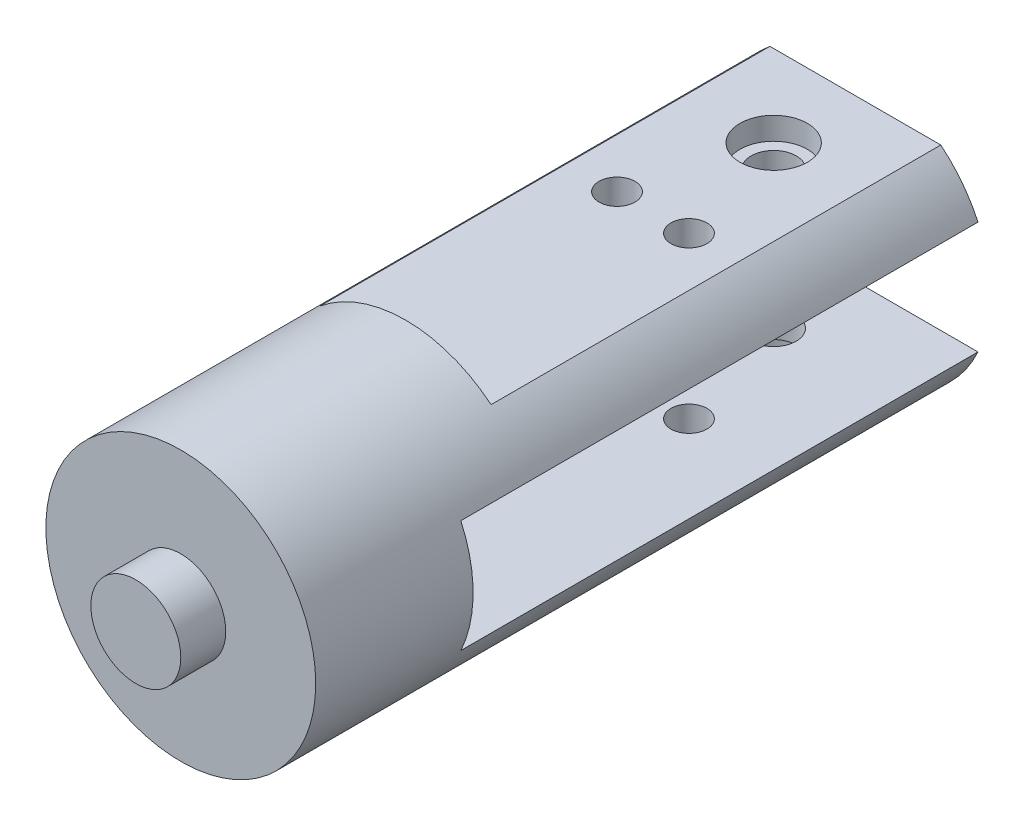
ISO-10303-21;
HEADER;
FILE_DESCRIPTION(('STEP AP214'),'2;1');
FILE_NAME('part.step','',(''),(''),'','','');
FILE_SCHEMA(('AUTOMOTIVE_DESIGN { 1 0 10303 214 1 1 1 1 }'));
ENDSEC;
DATA;
#1=APPLICATION_CONTEXT('core data for automotive mechanical design processes');
#2=APPLICATION_PROTOCOL_DEFINITION('international standard','automotive_design',2000,#1);
#3=PRODUCT_CONTEXT('',#1,'mechanical');
#4=PRODUCT('Part','Part','',(#3));
#5=PRODUCT_RELATED_PRODUCT_CATEGORY('part','',(#4));
#6=PRODUCT_DEFINITION_FORMATION('','',#4);
#7=PRODUCT_DEFINITION_CONTEXT('part definition',#1,'design');
#8=PRODUCT_DEFINITION('design','',#6,#7);
#9=PRODUCT_DEFINITION_SHAPE('','',#8);
#10=(LENGTH_UNIT() NAMED_UNIT(*) SI_UNIT(.MILLI.,.METRE.));
#11=(NAMED_UNIT(*) PLANE_ANGLE_UNIT() SI_UNIT($,.RADIAN.));
#12=(NAMED_UNIT(*) SI_UNIT($,.STERADIAN.) SOLID_ANGLE_UNIT());
#13=UNCERTAINTY_MEASURE_WITH_UNIT(LENGTH_MEASURE(1.E-05),#10,'distance_accuracy_value','');
#14=(GEOMETRIC_REPRESENTATION_CONTEXT(3) GLOBAL_UNCERTAINTY_ASSIGNED_CONTEXT((#13)) GLOBAL_UNIT_ASSIGNED_CONTEXT((#10,
#11,#12)) REPRESENTATION_CONTEXT('',''));
#15=CARTESIAN_POINT('',(0.,0.,0.));
#16=DIRECTION('',(0.,0.,1.));
#17=DIRECTION('',(1.,0.,0.));
#18=AXIS2_PLACEMENT_3D('',#15,#16,#17);
#19=CARTESIAN_POINT('',(0.,0.,-13.8805113827507));
#20=DIRECTION('',(0.,0.,-1.));
#21=DIRECTION('',(-1.,0.,0.));
#22=AXIS2_PLACEMENT_3D('',#19,#20,#21);
#23=CYLINDRICAL_SURFACE('',#22,9.);
#24=CARTESIAN_POINT('',(0.,0.,-13.8805113827507));
#25=DIRECTION('',(0.,0.,1.));
#26=DIRECTION('',(1.,0.,0.));
#27=AXIS2_PLACEMENT_3D('',#24,#25,#26);
#28=CIRCLE('',#27,9.);
#29=CARTESIAN_POINT('',(9.,0.,-13.8805113827507));
#30=VERTEX_POINT('',#29);
#31=EDGE_CURVE('E12',#30,#30,#28,.T.);
#32=ORIENTED_EDGE('',*,*,#31,.F.);
#33=EDGE_LOOP('',(#32));
#34=FACE_BOUND('',#33,.T.);
#35=CARTESIAN_POINT('',(0.,0.,-28.8805113827507));
#36=DIRECTION('',(0.,0.,-1.));
#37=DIRECTION('',(1.,0.,0.));
#38=AXIS2_PLACEMENT_3D('',#35,#36,#37);
#39=CIRCLE('',#38,9.00000000000002);
#40=CARTESIAN_POINT('',(-5.7,6.96491205974634,-28.8805113827507));
#41=VERTEX_POINT('',#40);
#42=CARTESIAN_POINT('',(5.7,6.96491205974634,-28.8805113827507));
#43=VERTEX_POINT('',#42);
#44=EDGE_CURVE('E131',#41,#43,#39,.T.);
#45=ORIENTED_EDGE('',*,*,#44,.F.);
#46=DIRECTION('',(0.,0.,-1.));
#47=VECTOR('',#46,1.);
#48=CARTESIAN_POINT('',(-5.7,6.96491205974634,-28.8805113827507));
#49=LINE('',#48,#47);
#50=CARTESIAN_POINT('',(-5.7,6.96491205974634,-58.8805113827507));
#51=VERTEX_POINT('',#50);
#52=EDGE_CURVE('E139',#41,#51,#49,.T.);
#53=ORIENTED_EDGE('',*,*,#52,.T.);
#54=CARTESIAN_POINT('',(0.,0.,-58.8805113827507));
#55=DIRECTION('',(0.,0.,1.));
#56=DIRECTION('',(1.,0.,0.));
#57=AXIS2_PLACEMENT_3D('',#54,#55,#56);
#58=CIRCLE('',#57,9.);
#59=CARTESIAN_POINT('',(-8.18153408597679,3.75,-58.8805113827507));
#60=VERTEX_POINT('',#59);
#61=EDGE_CURVE('E191',#51,#60,#58,.T.);
#62=ORIENTED_EDGE('',*,*,#61,.T.);
#63=DIRECTION('',(0.,0.,-1.));
#64=VECTOR('',#63,1.);
#65=CARTESIAN_POINT('',(-8.18153408597679,3.75,-24.3805113827507));
#66=LINE('',#65,#64);
#67=CARTESIAN_POINT('',(-8.18153408597679,3.75,-24.3805113827507));
#68=VERTEX_POINT('',#67);
#69=EDGE_CURVE('E175',#68,#60,#66,.T.);
#70=ORIENTED_EDGE('',*,*,#69,.F.);
#71=CARTESIAN_POINT('',(0.,0.,-24.3805113827507));
#72=DIRECTION('',(0.,0.,-1.));
#73=DIRECTION('',(-1.,0.,0.));
#74=AXIS2_PLACEMENT_3D('',#71,#72,#73);
#75=CIRCLE('',#74,9.);
#76=CARTESIAN_POINT('',(-8.18153408597679,-3.75,-24.3805113827507));
#77=VERTEX_POINT('',#76);
#78=EDGE_CURVE('E172',#77,#68,#75,.T.);
#79=ORIENTED_EDGE('',*,*,#78,.F.);
#80=DIRECTION('',(0.,0.,-1.));
#81=VECTOR('',#80,1.);
#82=CARTESIAN_POINT('',(-8.18153408597679,-3.75,-24.3805113827507));
#83=LINE('',#82,#81);
#84=CARTESIAN_POINT('',(-8.18153408597679,-3.75,-58.8805113827507));
#85=VERTEX_POINT('',#84);
#86=EDGE_CURVE('E166',#77,#85,#83,.T.);
#87=ORIENTED_EDGE('',*,*,#86,.T.);
#88=CARTESIAN_POINT('',(-5.7,-6.96491205974634,-58.8805113827507));
#89=VERTEX_POINT('',#88);
#90=EDGE_CURVE('E192',#85,#89,#58,.T.);
#91=ORIENTED_EDGE('',*,*,#90,.T.);
#92=DIRECTION('',(0.,0.,-1.));
#93=VECTOR('',#92,1.);
#94=CARTESIAN_POINT('',(-5.7,-6.96491205974634,-28.8805113827507));
#95=LINE('',#94,#93);
#96=CARTESIAN_POINT('',(-5.7,-6.96491205974634,-28.8805113827507));
#97=VERTEX_POINT('',#96);
#98=EDGE_CURVE('E87',#97,#89,#95,.T.);
#99=ORIENTED_EDGE('',*,*,#98,.F.);
#100=CARTESIAN_POINT('',(0.,0.,-28.8805113827507));
#101=DIRECTION('',(0.,0.,-1.));
#102=DIRECTION('',(-1.,0.,0.));
#103=AXIS2_PLACEMENT_3D('',#100,#101,#102);
#104=CIRCLE('',#103,8.99999999999996);
#105=CARTESIAN_POINT('',(5.7,-6.96491205974634,-28.8805113827507));
#106=VERTEX_POINT('',#105);
#107=EDGE_CURVE('E158',#106,#97,#104,.T.);
#108=ORIENTED_EDGE('',*,*,#107,.F.);
#109=DIRECTION('',(0.,0.,-1.));
#110=VECTOR('',#109,1.);
#111=CARTESIAN_POINT('',(5.7,-6.96491205974634,-28.8805113827507));
#112=LINE('',#111,#110);
#113=CARTESIAN_POINT('',(5.7,-6.96491205974634,-58.8805113827507));
#114=VERTEX_POINT('',#113);
#115=EDGE_CURVE('E152',#106,#114,#112,.T.);
#116=ORIENTED_EDGE('',*,*,#115,.T.);
#117=CARTESIAN_POINT('',(8.18153408597679,-3.75,-58.8805113827507));
#118=VERTEX_POINT('',#117);
#119=EDGE_CURVE('E170',#114,#118,#58,.T.);
#120=ORIENTED_EDGE('',*,*,#119,.T.);
#121=DIRECTION('',(0.,0.,-1.));
#122=VECTOR('',#121,1.);
#123=CARTESIAN_POINT('',(8.18153408597678,-3.75,-24.3805113827507));
#124=LINE('',#123,#122);
#125=CARTESIAN_POINT('',(8.18153408597678,-3.75,-24.3805113827507));
#126=VERTEX_POINT('',#125);
#127=EDGE_CURVE('E167',#126,#118,#124,.T.);
#128=ORIENTED_EDGE('',*,*,#127,.F.);
#129=CARTESIAN_POINT('',(0.,0.,-24.3805113827507));
#130=DIRECTION('',(0.,0.,-1.));
#131=DIRECTION('',(-1.,0.,0.));
#132=AXIS2_PLACEMENT_3D('',#129,#130,#131);
#133=CIRCLE('',#132,9.);
#134=CARTESIAN_POINT('',(8.18153408597678,3.75,-24.3805113827507));
#135=VERTEX_POINT('',#134);
#136=EDGE_CURVE('E162',#135,#126,#133,.T.);
#137=ORIENTED_EDGE('',*,*,#136,.F.);
#138=DIRECTION('',(0.,0.,-1.));
#139=VECTOR('',#138,1.);
#140=CARTESIAN_POINT('',(8.18153408597678,3.75,-24.3805113827507));
#141=LINE('',#140,#139);
#142=CARTESIAN_POINT('',(8.18153408597678,3.75,-58.8805113827507));
#143=VERTEX_POINT('',#142);
#144=EDGE_CURVE('E165',#135,#143,#141,.T.);
#145=ORIENTED_EDGE('',*,*,#144,.T.);
#146=CARTESIAN_POINT('',(5.7,6.96491205974634,-58.8805113827507));
#147=VERTEX_POINT('',#146);
#148=EDGE_CURVE('E144',#143,#147,#58,.T.);
#149=ORIENTED_EDGE('',*,*,#148,.T.);
#150=DIRECTION('',(0.,0.,-1.));
#151=VECTOR('',#150,1.);
#152=CARTESIAN_POINT('',(5.7,6.96491205974634,-28.8805113827507));
#153=LINE('',#152,#151);
#154=EDGE_CURVE('E79',#43,#147,#153,.T.);
#155=ORIENTED_EDGE('',*,*,#154,.F.);
#156=EDGE_LOOP('',(#45,#53,#62,#70,#79,#87,#91,#99,#108,#116,#120,#128,#137,#145,#149,#155));
#157=FACE_BOUND('',#156,.T.);
#158=ADVANCED_FACE('F63',(#34,#157),#23,.T.);
#159=CARTESIAN_POINT('',(0.,0.,-58.8805113827507));
#160=DIRECTION('',(0.,0.,1.));
#161=DIRECTION('',(1.,0.,0.));
#162=AXIS2_PLACEMENT_3D('',#159,#160,#161);
#163=PLANE('',#162);
#164=ORIENTED_EDGE('',*,*,#61,.F.);
#165=DIRECTION('',(-1.,0.,0.));
#166=VECTOR('',#165,1.);
#167=CARTESIAN_POINT('',(5.7,6.96491205974634,-58.8805113827507));
#168=LINE('',#167,#166);
#169=EDGE_CURVE('E136',#147,#51,#168,.T.);
#170=ORIENTED_EDGE('',*,*,#169,.F.);
#171=ORIENTED_EDGE('',*,*,#148,.F.);
#172=DIRECTION('',(-1.,0.,0.));
#173=VECTOR('',#172,1.);
#174=CARTESIAN_POINT('',(8.18153408597678,3.75,-58.8805113827507));
#175=LINE('',#174,#173);
#176=EDGE_CURVE('E184',#143,#60,#175,.T.);
#177=ORIENTED_EDGE('',*,*,#176,.T.);
#178=EDGE_LOOP('',(#164,#170,#171,#177));
#179=FACE_BOUND('',#178,.T.);
#180=ADVANCED_FACE('F242',(#179),#163,.F.);
#181=CARTESIAN_POINT('',(0.,0.,-13.8805113827507));
#182=DIRECTION('',(0.,0.,1.));
#183=DIRECTION('',(1.,0.,0.));
#184=AXIS2_PLACEMENT_3D('',#181,#182,#183);
#185=PLANE('',#184);
#186=CARTESIAN_POINT('',(0.,0.,-13.8805113827507));
#187=DIRECTION('',(0.,0.,1.));
#188=DIRECTION('',(1.,0.,0.));
#189=AXIS2_PLACEMENT_3D('',#186,#187,#188);
#190=CIRCLE('',#189,3.);
#191=CARTESIAN_POINT('',(3.,0.,-13.8805113827507));
#192=VERTEX_POINT('',#191);
#193=EDGE_CURVE('E71',#192,#192,#190,.F.);
#194=ORIENTED_EDGE('',*,*,#193,.T.);
#195=EDGE_LOOP('',(#194));
#196=FACE_BOUND('',#195,.T.);
#197=ORIENTED_EDGE('',*,*,#31,.T.);
#198=EDGE_LOOP('',(#197));
#199=FACE_BOUND('',#198,.T.);
#200=ADVANCED_FACE('F276',(#196,#199),#185,.T.);
#201=CARTESIAN_POINT('',(0.,0.,-10.8805113827507));
#202=DIRECTION('',(0.,0.,-1.));
#203=DIRECTION('',(-1.,0.,0.));
#204=AXIS2_PLACEMENT_3D('',#201,#202,#203);
#205=CYLINDRICAL_SURFACE('',#204,3.);
#206=ORIENTED_EDGE('',*,*,#193,.F.);
#207=EDGE_LOOP('',(#206));
#208=FACE_BOUND('',#207,.T.);
#209=CARTESIAN_POINT('',(0.,0.,-10.8805113827507));
#210=DIRECTION('',(0.,0.,1.));
#211=DIRECTION('',(1.,0.,0.));
#212=AXIS2_PLACEMENT_3D('',#209,#210,#211);
#213=CIRCLE('',#212,3.);
#214=CARTESIAN_POINT('',(3.,0.,-10.8805113827507));
#215=VERTEX_POINT('',#214);
#216=EDGE_CURVE('E190',#215,#215,#213,.T.);
#217=ORIENTED_EDGE('',*,*,#216,.F.);
#218=EDGE_LOOP('',(#217));
#219=FACE_BOUND('',#218,.T.);
#220=ADVANCED_FACE('F281',(#208,#219),#205,.T.);
#221=CARTESIAN_POINT('',(0.,0.,-10.8805113827507));
#222=DIRECTION('',(0.,0.,1.));
#223=DIRECTION('',(1.,0.,0.));
#224=AXIS2_PLACEMENT_3D('',#221,#222,#223);
#225=PLANE('',#224);
#226=ORIENTED_EDGE('',*,*,#216,.T.);
#227=EDGE_LOOP('',(#226));
#228=FACE_BOUND('',#227,.T.);
#229=ADVANCED_FACE('F286',(#228),#225,.T.);
#230=ORIENTED_EDGE('',*,*,#119,.F.);
#231=DIRECTION('',(1.,0.,0.));
#232=VECTOR('',#231,1.);
#233=CARTESIAN_POINT('',(5.7,-6.96491205974634,-58.8805113827507));
#234=LINE('',#233,#232);
#235=EDGE_CURVE('E156',#89,#114,#234,.T.);
#236=ORIENTED_EDGE('',*,*,#235,.F.);
#237=ORIENTED_EDGE('',*,*,#90,.F.);
#238=DIRECTION('',(-1.,0.,0.));
#239=VECTOR('',#238,1.);
#240=CARTESIAN_POINT('',(8.18153408597678,-3.75,-58.8805113827507));
#241=LINE('',#240,#239);
#242=EDGE_CURVE('E146',#118,#85,#241,.T.);
#243=ORIENTED_EDGE('',*,*,#242,.F.);
#244=EDGE_LOOP('',(#230,#236,#237,#243));
#245=FACE_BOUND('',#244,.T.);
#246=ADVANCED_FACE('F253',(#245),#163,.F.);
#247=CARTESIAN_POINT('',(0.,0.,-24.3805113827507));
#248=DIRECTION('',(0.,0.,-1.));
#249=DIRECTION('',(-1.,0.,0.));
#250=AXIS2_PLACEMENT_3D('',#247,#248,#249);
#251=PLANE('',#250);
#252=ORIENTED_EDGE('',*,*,#136,.T.);
#253=DIRECTION('',(-1.,0.,0.));
#254=VECTOR('',#253,1.);
#255=CARTESIAN_POINT('',(8.18153408597678,-3.75,-24.3805113827507));
#256=LINE('',#255,#254);
#257=EDGE_CURVE('E181',#126,#77,#256,.T.);
#258=ORIENTED_EDGE('',*,*,#257,.T.);
#259=ORIENTED_EDGE('',*,*,#78,.T.);
#260=DIRECTION('',(-1.,0.,0.));
#261=VECTOR('',#260,1.);
#262=CARTESIAN_POINT('',(8.18153408597678,3.75,-24.3805113827507));
#263=LINE('',#262,#261);
#264=EDGE_CURVE('E176',#135,#68,#263,.T.);
#265=ORIENTED_EDGE('',*,*,#264,.F.);
#266=EDGE_LOOP('',(#252,#258,#259,#265));
#267=FACE_BOUND('',#266,.T.);
#268=ADVANCED_FACE('F256',(#267),#251,.T.);
#269=CARTESIAN_POINT('',(8.18153408597678,3.75,-24.3805113827507));
#270=DIRECTION('',(0.,-1.,0.));
#271=DIRECTION('',(0.,0.,-1.));
#272=AXIS2_PLACEMENT_3D('',#269,#270,#271);
#273=PLANE('',#272);
#274=CARTESIAN_POINT('',(0.,3.75,-53.4334177826149));
#275=DIRECTION('',(0.,-1.,0.));
#276=DIRECTION('',(0.,0.,-1.));
#277=AXIS2_PLACEMENT_3D('',#274,#275,#276);
#278=CIRCLE('',#277,1.5);
#279=CARTESIAN_POINT('',(0.,3.75,-54.9334177826149));
#280=VERTEX_POINT('',#279);
#281=EDGE_CURVE('E199',#280,#280,#278,.F.);
#282=ORIENTED_EDGE('',*,*,#281,.T.);
#283=EDGE_LOOP('',(#282));
#284=FACE_BOUND('',#283,.T.);
#285=CARTESIAN_POINT('',(-2.4,3.75,-45.3805113827507));
#286=DIRECTION('',(0.,-1.,0.));
#287=DIRECTION('',(0.,0.,-1.));
#288=AXIS2_PLACEMENT_3D('',#285,#286,#287);
#289=CIRCLE('',#288,1.2);
#290=CARTESIAN_POINT('',(-2.4,3.75,-46.5805113827507));
#291=VERTEX_POINT('',#290);
#292=EDGE_CURVE('E155',#291,#291,#289,.T.);
#293=ORIENTED_EDGE('',*,*,#292,.F.);
#294=EDGE_LOOP('',(#293));
#295=FACE_BOUND('',#294,.T.);
#296=CARTESIAN_POINT('',(2.4,3.75,-45.3805113827507));
#297=DIRECTION('',(0.,-1.,0.));
#298=DIRECTION('',(0.,0.,-1.));
#299=AXIS2_PLACEMENT_3D('',#296,#297,#298);
#300=CIRCLE('',#299,1.2);
#301=CARTESIAN_POINT('',(2.4,3.75,-46.5805113827507));
#302=VERTEX_POINT('',#301);
#303=EDGE_CURVE('E229',#302,#302,#300,.T.);
#304=ORIENTED_EDGE('',*,*,#303,.F.);
#305=EDGE_LOOP('',(#304));
#306=FACE_BOUND('',#305,.T.);
#307=ORIENTED_EDGE('',*,*,#176,.F.);
#308=ORIENTED_EDGE('',*,*,#144,.F.);
#309=ORIENTED_EDGE('',*,*,#264,.T.);
#310=ORIENTED_EDGE('',*,*,#69,.T.);
#311=EDGE_LOOP('',(#307,#308,#309,#310));
#312=FACE_BOUND('',#311,.T.);
#313=ADVANCED_FACE('F259',(#284,#295,#306,#312),#273,.T.);
#314=CARTESIAN_POINT('',(8.18153408597678,-3.75,-24.3805113827507));
#315=DIRECTION('',(0.,-1.,0.));
#316=DIRECTION('',(0.,0.,-1.));
#317=AXIS2_PLACEMENT_3D('',#314,#315,#316);
#318=PLANE('',#317);
#319=CARTESIAN_POINT('',(0.,-3.75,-53.4334177826149));
#320=DIRECTION('',(0.,-1.,0.));
#321=DIRECTION('',(0.,0.,-1.));
#322=AXIS2_PLACEMENT_3D('',#319,#320,#321);
#323=CIRCLE('',#322,1.5);
#324=CARTESIAN_POINT('',(0.,-3.75,-54.9334177826149));
#325=VERTEX_POINT('',#324);
#326=EDGE_CURVE('E465',#325,#325,#323,.F.);
#327=ORIENTED_EDGE('',*,*,#326,.F.);
#328=EDGE_LOOP('',(#327));
#329=FACE_BOUND('',#328,.T.);
#330=CARTESIAN_POINT('',(-2.4,-3.75,-45.3805113827507));
#331=DIRECTION('',(0.,-1.,0.));
#332=DIRECTION('',(0.,0.,-1.));
#333=AXIS2_PLACEMENT_3D('',#330,#331,#332);
#334=CIRCLE('',#333,1.2);
#335=CARTESIAN_POINT('',(-2.4,-3.75,-46.5805113827507));
#336=VERTEX_POINT('',#335);
#337=EDGE_CURVE('E235',#336,#336,#334,.T.);
#338=ORIENTED_EDGE('',*,*,#337,.T.);
#339=EDGE_LOOP('',(#338));
#340=FACE_BOUND('',#339,.T.);
#341=CARTESIAN_POINT('',(2.4,-3.75,-45.3805113827507));
#342=DIRECTION('',(0.,-1.,0.));
#343=DIRECTION('',(0.,0.,-1.));
#344=AXIS2_PLACEMENT_3D('',#341,#342,#343);
#345=CIRCLE('',#344,1.2);
#346=CARTESIAN_POINT('',(2.4,-3.75,-46.5805113827507));
#347=VERTEX_POINT('',#346);
#348=EDGE_CURVE('E226',#347,#347,#345,.T.);
#349=ORIENTED_EDGE('',*,*,#348,.T.);
#350=EDGE_LOOP('',(#349));
#351=FACE_BOUND('',#350,.T.);
#352=ORIENTED_EDGE('',*,*,#242,.T.);
#353=ORIENTED_EDGE('',*,*,#86,.F.);
#354=ORIENTED_EDGE('',*,*,#257,.F.);
#355=ORIENTED_EDGE('',*,*,#127,.T.);
#356=EDGE_LOOP('',(#352,#353,#354,#355));
#357=FACE_BOUND('',#356,.T.);
#358=ADVANCED_FACE('F251',(#329,#340,#351,#357),#318,.F.);
#359=CARTESIAN_POINT('',(5.7,-6.96491205974634,-28.8805113827507));
#360=DIRECTION('',(0.,1.,0.));
#361=DIRECTION('',(0.,0.,1.));
#362=AXIS2_PLACEMENT_3D('',#359,#360,#361);
#363=PLANE('',#362);
#364=CARTESIAN_POINT('',(0.,-6.96491205974634,-53.4334177826149));
#365=DIRECTION('',(0.,1.,0.));
#366=DIRECTION('',(0.,0.,1.));
#367=AXIS2_PLACEMENT_3D('',#364,#365,#366);
#368=CIRCLE('',#367,2.25);
#369=CARTESIAN_POINT('',(0.,-6.96491205974634,-51.1834177826149));
#370=VERTEX_POINT('',#369);
#371=EDGE_CURVE('E211',#370,#370,#368,.T.);
#372=ORIENTED_EDGE('',*,*,#371,.T.);
#373=EDGE_LOOP('',(#372));
#374=FACE_BOUND('',#373,.T.);
#375=CARTESIAN_POINT('',(-2.4,-6.96491205974634,-45.3805113827507));
#376=DIRECTION('',(0.,1.,0.));
#377=DIRECTION('',(0.,0.,1.));
#378=AXIS2_PLACEMENT_3D('',#375,#376,#377);
#379=CIRCLE('',#378,1.2);
#380=CARTESIAN_POINT('',(-2.4,-6.96491205974634,-44.1805113827507));
#381=VERTEX_POINT('',#380);
#382=EDGE_CURVE('E232',#381,#381,#379,.T.);
#383=ORIENTED_EDGE('',*,*,#382,.T.);
#384=EDGE_LOOP('',(#383));
#385=FACE_BOUND('',#384,.T.);
#386=CARTESIAN_POINT('',(2.4,-6.96491205974634,-45.3805113827507));
#387=DIRECTION('',(0.,1.,0.));
#388=DIRECTION('',(0.,0.,1.));
#389=AXIS2_PLACEMENT_3D('',#386,#387,#388);
#390=CIRCLE('',#389,1.2);
#391=CARTESIAN_POINT('',(2.4,-6.96491205974634,-44.1805113827507));
#392=VERTEX_POINT('',#391);
#393=EDGE_CURVE('E221',#392,#392,#390,.T.);
#394=ORIENTED_EDGE('',*,*,#393,.T.);
#395=EDGE_LOOP('',(#394));
#396=FACE_BOUND('',#395,.T.);
#397=ORIENTED_EDGE('',*,*,#235,.T.);
#398=ORIENTED_EDGE('',*,*,#115,.F.);
#399=DIRECTION('',(1.,0.,0.));
#400=VECTOR('',#399,1.);
#401=CARTESIAN_POINT('',(5.7,-6.96491205974634,-28.8805113827507));
#402=LINE('',#401,#400);
#403=EDGE_CURVE('E151',#97,#106,#402,.T.);
#404=ORIENTED_EDGE('',*,*,#403,.F.);
#405=ORIENTED_EDGE('',*,*,#98,.T.);
#406=EDGE_LOOP('',(#397,#398,#404,#405));
#407=FACE_BOUND('',#406,.T.);
#408=ADVANCED_FACE('F266',(#374,#385,#396,#407),#363,.F.);
#409=CARTESIAN_POINT('',(0.,0.,-28.8805113827507));
#410=DIRECTION('',(0.,0.,-1.));
#411=DIRECTION('',(-1.,0.,0.));
#412=AXIS2_PLACEMENT_3D('',#409,#410,#411);
#413=PLANE('',#412);
#414=ORIENTED_EDGE('',*,*,#107,.T.);
#415=ORIENTED_EDGE('',*,*,#403,.T.);
#416=EDGE_LOOP('',(#414,#415));
#417=FACE_BOUND('',#416,.T.);
#418=ADVANCED_FACE('F327',(#417),#413,.T.);
#419=CARTESIAN_POINT('',(5.7,6.96491205974634,-28.8805113827507));
#420=DIRECTION('',(0.,-1.,0.));
#421=DIRECTION('',(0.,0.,-1.));
#422=AXIS2_PLACEMENT_3D('',#419,#420,#421);
#423=PLANE('',#422);
#424=CARTESIAN_POINT('',(0.,6.96491205974634,-53.4334177826149));
#425=DIRECTION('',(0.,1.,0.));
#426=DIRECTION('',(0.,0.,1.));
#427=AXIS2_PLACEMENT_3D('',#424,#425,#426);
#428=CIRCLE('',#427,2.25);
#429=CARTESIAN_POINT('',(0.,6.96491205974634,-51.1834177826149));
#430=VERTEX_POINT('',#429);
#431=EDGE_CURVE('E198',#430,#430,#428,.T.);
#432=ORIENTED_EDGE('',*,*,#431,.F.);
#433=EDGE_LOOP('',(#432));
#434=FACE_BOUND('',#433,.T.);
#435=CARTESIAN_POINT('',(-2.4,6.96491205974634,-45.3805113827507));
#436=DIRECTION('',(0.,1.,0.));
#437=DIRECTION('',(0.,0.,1.));
#438=AXIS2_PLACEMENT_3D('',#435,#436,#437);
#439=CIRCLE('',#438,1.2);
#440=CARTESIAN_POINT('',(-2.4,6.96491205974634,-44.1805113827507));
#441=VERTEX_POINT('',#440);
#442=EDGE_CURVE('E218',#441,#441,#439,.T.);
#443=ORIENTED_EDGE('',*,*,#442,.F.);
#444=EDGE_LOOP('',(#443));
#445=FACE_BOUND('',#444,.T.);
#446=CARTESIAN_POINT('',(2.4,6.96491205974634,-45.3805113827507));
#447=DIRECTION('',(0.,1.,0.));
#448=DIRECTION('',(0.,0.,1.));
#449=AXIS2_PLACEMENT_3D('',#446,#447,#448);
#450=CIRCLE('',#449,1.2);
#451=CARTESIAN_POINT('',(2.4,6.96491205974634,-44.1805113827507));
#452=VERTEX_POINT('',#451);
#453=EDGE_CURVE('E216',#452,#452,#450,.T.);
#454=ORIENTED_EDGE('',*,*,#453,.F.);
#455=EDGE_LOOP('',(#454));
#456=FACE_BOUND('',#455,.T.);
#457=ORIENTED_EDGE('',*,*,#169,.T.);
#458=ORIENTED_EDGE('',*,*,#52,.F.);
#459=DIRECTION('',(-1.,0.,0.));
#460=VECTOR('',#459,1.);
#461=CARTESIAN_POINT('',(5.7,6.96491205974634,-28.8805113827507));
#462=LINE('',#461,#460);
#463=EDGE_CURVE('E133',#43,#41,#462,.T.);
#464=ORIENTED_EDGE('',*,*,#463,.F.);
#465=ORIENTED_EDGE('',*,*,#154,.T.);
#466=EDGE_LOOP('',(#457,#458,#464,#465));
#467=FACE_BOUND('',#466,.T.);
#468=ADVANCED_FACE('F138',(#434,#445,#456,#467),#423,.F.);
#469=CARTESIAN_POINT('',(0.,0.,-28.8805113827507));
#470=DIRECTION('',(0.,0.,1.));
#471=DIRECTION('',(1.,0.,0.));
#472=AXIS2_PLACEMENT_3D('',#469,#470,#471);
#473=PLANE('',#472);
#474=ORIENTED_EDGE('',*,*,#44,.T.);
#475=ORIENTED_EDGE('',*,*,#463,.T.);
#476=EDGE_LOOP('',(#474,#475));
#477=FACE_BOUND('',#476,.T.);
#478=ADVANCED_FACE('F132',(#477),#473,.F.);
#479=CARTESIAN_POINT('',(2.4,-23.0350879402537,-45.3805113827507));
#480=DIRECTION('',(0.,1.,0.));
#481=DIRECTION('',(0.,0.,1.));
#482=AXIS2_PLACEMENT_3D('',#479,#480,#481);
#483=CYLINDRICAL_SURFACE('',#482,1.2);
#484=ORIENTED_EDGE('',*,*,#303,.T.);
#485=EDGE_LOOP('',(#484));
#486=FACE_BOUND('',#485,.T.);
#487=ORIENTED_EDGE('',*,*,#453,.T.);
#488=EDGE_LOOP('',(#487));
#489=FACE_BOUND('',#488,.T.);
#490=ADVANCED_FACE('F355',(#486,#489),#483,.F.);
#491=CARTESIAN_POINT('',(-2.4,-23.0350879402537,-45.3805113827507));
#492=DIRECTION('',(0.,1.,0.));
#493=DIRECTION('',(0.,0.,1.));
#494=AXIS2_PLACEMENT_3D('',#491,#492,#493);
#495=CYLINDRICAL_SURFACE('',#494,1.2);
#496=ORIENTED_EDGE('',*,*,#292,.T.);
#497=EDGE_LOOP('',(#496));
#498=FACE_BOUND('',#497,.T.);
#499=ORIENTED_EDGE('',*,*,#442,.T.);
#500=EDGE_LOOP('',(#499));
#501=FACE_BOUND('',#500,.T.);
#502=ADVANCED_FACE('F364',(#498,#501),#495,.F.);
#503=ORIENTED_EDGE('',*,*,#393,.F.);
#504=EDGE_LOOP('',(#503));
#505=FACE_BOUND('',#504,.T.);
#506=ORIENTED_EDGE('',*,*,#348,.F.);
#507=EDGE_LOOP('',(#506));
#508=FACE_BOUND('',#507,.T.);
#509=ADVANCED_FACE('F367',(#505,#508),#483,.F.);
#510=ORIENTED_EDGE('',*,*,#382,.F.);
#511=EDGE_LOOP('',(#510));
#512=FACE_BOUND('',#511,.T.);
#513=ORIENTED_EDGE('',*,*,#337,.F.);
#514=EDGE_LOOP('',(#513));
#515=FACE_BOUND('',#514,.T.);
#516=ADVANCED_FACE('F377',(#512,#515),#495,.F.);
#517=CARTESIAN_POINT('',(0.,5.46491205974634,-53.4334177826149));
#518=DIRECTION('',(0.,1.,0.));
#519=DIRECTION('',(0.,0.,1.));
#520=AXIS2_PLACEMENT_3D('',#517,#518,#519);
#521=CYLINDRICAL_SURFACE('',#520,2.25);
#522=CARTESIAN_POINT('',(0.,5.46491205974634,-53.4334177826149));
#523=DIRECTION('',(0.,1.,0.));
#524=DIRECTION('',(0.,0.,1.));
#525=AXIS2_PLACEMENT_3D('',#522,#523,#524);
#526=CIRCLE('',#525,2.25);
#527=CARTESIAN_POINT('',(0.,5.46491205974634,-51.1834177826149));
#528=VERTEX_POINT('',#527);
#529=EDGE_CURVE('E203',#528,#528,#526,.T.);
#530=ORIENTED_EDGE('',*,*,#529,.F.);
#531=EDGE_LOOP('',(#530));
#532=FACE_BOUND('',#531,.T.);
#533=ORIENTED_EDGE('',*,*,#431,.T.);
#534=EDGE_LOOP('',(#533));
#535=FACE_BOUND('',#534,.T.);
#536=ADVANCED_FACE('F393',(#532,#535),#521,.F.);
#537=CARTESIAN_POINT('',(0.,5.46491205974634,-21.3805113827507));
#538=DIRECTION('',(0.,1.,0.));
#539=DIRECTION('',(0.,0.,1.));
#540=AXIS2_PLACEMENT_3D('',#537,#538,#539);
#541=PLANE('',#540);
#542=CARTESIAN_POINT('',(0.,5.46491205974634,-53.4334177826149));
#543=DIRECTION('',(0.,1.,0.));
#544=DIRECTION('',(0.,0.,1.));
#545=AXIS2_PLACEMENT_3D('',#542,#543,#544);
#546=CIRCLE('',#545,1.5);
#547=CARTESIAN_POINT('',(0.,5.46491205974634,-51.9334177826149));
#548=VERTEX_POINT('',#547);
#549=EDGE_CURVE('E196',#548,#548,#546,.T.);
#550=ORIENTED_EDGE('',*,*,#549,.F.);
#551=EDGE_LOOP('',(#550));
#552=FACE_BOUND('',#551,.T.);
#553=ORIENTED_EDGE('',*,*,#529,.T.);
#554=EDGE_LOOP('',(#553));
#555=FACE_BOUND('',#554,.T.);
#556=ADVANCED_FACE('F402',(#552,#555),#541,.T.);
#557=CARTESIAN_POINT('',(0.,-0.492640687119287,-53.4334177826149));
#558=DIRECTION('',(0.,1.,0.));
#559=DIRECTION('',(0.,0.,1.));
#560=AXIS2_PLACEMENT_3D('',#557,#558,#559);
#561=CYLINDRICAL_SURFACE('',#560,1.5);
#562=ORIENTED_EDGE('',*,*,#549,.T.);
#563=EDGE_LOOP('',(#562));
#564=FACE_BOUND('',#563,.T.);
#565=ORIENTED_EDGE('',*,*,#281,.F.);
#566=EDGE_LOOP('',(#565));
#567=FACE_BOUND('',#566,.T.);
#568=ADVANCED_FACE('F412',(#564,#567),#561,.F.);
#569=CARTESIAN_POINT('',(0.,-5.46491205974634,-53.4334177826149));
#570=DIRECTION('',(0.,-1.,0.));
#571=DIRECTION('',(0.,0.,-1.));
#572=AXIS2_PLACEMENT_3D('',#569,#570,#571);
#573=CYLINDRICAL_SURFACE('',#572,2.25);
#574=CARTESIAN_POINT('',(0.,-5.46491205974634,-53.4334177826149));
#575=DIRECTION('',(0.,1.,0.));
#576=DIRECTION('',(0.,0.,1.));
#577=AXIS2_PLACEMENT_3D('',#574,#575,#576);
#578=CIRCLE('',#577,2.25);
#579=CARTESIAN_POINT('',(0.,-5.46491205974634,-51.1834177826149));
#580=VERTEX_POINT('',#579);
#581=EDGE_CURVE('E206',#580,#580,#578,.T.);
#582=ORIENTED_EDGE('',*,*,#581,.T.);
#583=EDGE_LOOP('',(#582));
#584=FACE_BOUND('',#583,.T.);
#585=ORIENTED_EDGE('',*,*,#371,.F.);
#586=EDGE_LOOP('',(#585));
#587=FACE_BOUND('',#586,.T.);
#588=ADVANCED_FACE('F425',(#584,#587),#573,.F.);
#589=CARTESIAN_POINT('',(0.,-5.46491205974634,-21.3805113827507));
#590=DIRECTION('',(0.,-1.,0.));
#591=DIRECTION('',(0.,0.,1.));
#592=AXIS2_PLACEMENT_3D('',#589,#590,#591);
#593=PLANE('',#592);
#594=CARTESIAN_POINT('',(0.,-5.46491205974634,-53.4334177826149));
#595=DIRECTION('',(0.,-1.,0.));
#596=DIRECTION('',(0.,0.,-1.));
#597=AXIS2_PLACEMENT_3D('',#594,#595,#596);
#598=CIRCLE('',#597,1.5);
#599=CARTESIAN_POINT('',(0.,-5.46491205974634,-54.9334177826149));
#600=VERTEX_POINT('',#599);
#601=EDGE_CURVE('E66',#600,#600,#598,.F.);
#602=ORIENTED_EDGE('',*,*,#601,.T.);
#603=EDGE_LOOP('',(#602));
#604=FACE_BOUND('',#603,.T.);
#605=ORIENTED_EDGE('',*,*,#581,.F.);
#606=EDGE_LOOP('',(#605));
#607=FACE_BOUND('',#606,.T.);
#608=ADVANCED_FACE('F434',(#604,#607),#593,.T.);
#609=CARTESIAN_POINT('',(0.,7.99264068711929,-53.4334177826149));
#610=DIRECTION('',(0.,-1.,0.));
#611=DIRECTION('',(0.,0.,-1.));
#612=AXIS2_PLACEMENT_3D('',#609,#610,#611);
#613=CYLINDRICAL_SURFACE('',#612,1.5);
#614=CARTESIAN_POINT('',(0.,-5.46491205974634,-54.9334177826149));
#615=CARTESIAN_POINT('',(0.,-5.44704839245731,-54.9334177826149));
#616=CARTESIAN_POINT('',(0.,-5.42918472516829,-54.9334177826149));
#617=CARTESIAN_POINT('',(0.,-5.39345739059024,-54.9334177826149));
#618=CARTESIAN_POINT('',(0.,-5.37559372330122,-54.9334177826149));
#619=CARTESIAN_POINT('',(0.,-5.33986638872317,-54.9334177826149));
#620=CARTESIAN_POINT('',(0.,-5.32200272143414,-54.9334177826149));
#621=CARTESIAN_POINT('',(0.,-5.28627538685609,-54.9334177826149));
#622=CARTESIAN_POINT('',(0.,-5.26841171956707,-54.9334177826149));
#623=CARTESIAN_POINT('',(0.,-5.23268438498902,-54.9334177826149));
#624=CARTESIAN_POINT('',(0.,-5.2148207177,-54.9334177826149));
#625=CARTESIAN_POINT('',(0.,-5.17909338312195,-54.9334177826149));
#626=CARTESIAN_POINT('',(0.,-5.16122971583292,-54.9334177826149));
#627=CARTESIAN_POINT('',(0.,-5.12550238125487,-54.9334177826149));
#628=CARTESIAN_POINT('',(0.,-5.10763871396585,-54.9334177826149));
#629=CARTESIAN_POINT('',(0.,-5.0719113793878,-54.9334177826149));
#630=CARTESIAN_POINT('',(0.,-5.05404771209878,-54.9334177826149));
#631=CARTESIAN_POINT('',(0.,-5.01832037752073,-54.9334177826149));
#632=CARTESIAN_POINT('',(0.,-5.0004567102317,-54.9334177826149));
#633=CARTESIAN_POINT('',(0.,-4.96472937565366,-54.9334177826149));
#634=CARTESIAN_POINT('',(0.,-4.94686570836463,-54.9334177826149));
#635=CARTESIAN_POINT('',(0.,-4.91113837378658,-54.9334177826149));
#636=CARTESIAN_POINT('',(0.,-4.89327470649756,-54.9334177826149));
#637=CARTESIAN_POINT('',(0.,-4.85754737191951,-54.9334177826149));
#638=CARTESIAN_POINT('',(0.,-4.83968370463048,-54.9334177826149));
#639=CARTESIAN_POINT('',(0.,-4.80395637005243,-54.9334177826149));
#640=CARTESIAN_POINT('',(0.,-4.78609270276341,-54.9334177826149));
#641=CARTESIAN_POINT('',(0.,-4.75036536818536,-54.9334177826149));
#642=CARTESIAN_POINT('',(0.,-4.73250170089634,-54.9334177826149));
#643=CARTESIAN_POINT('',(0.,-4.69677436631829,-54.9334177826149));
#644=CARTESIAN_POINT('',(0.,-4.67891069902926,-54.9334177826149));
#645=CARTESIAN_POINT('',(0.,-4.64318336445122,-54.9334177826149));
#646=CARTESIAN_POINT('',(0.,-4.62531969716219,-54.9334177826149));
#647=CARTESIAN_POINT('',(0.,-4.58959236258414,-54.9334177826149));
#648=CARTESIAN_POINT('',(0.,-4.57172869529512,-54.9334177826149));
#649=CARTESIAN_POINT('',(0.,-4.53600136071707,-54.9334177826149));
#650=CARTESIAN_POINT('',(0.,-4.51813769342805,-54.9334177826149));
#651=CARTESIAN_POINT('',(0.,-4.48241035885,-54.9334177826149));
#652=CARTESIAN_POINT('',(0.,-4.46454669156097,-54.9334177826149));
#653=CARTESIAN_POINT('',(0.,-4.42881935698292,-54.9334177826149));
#654=CARTESIAN_POINT('',(0.,-4.4109556896939,-54.9334177826149));
#655=CARTESIAN_POINT('',(0.,-4.37522835511585,-54.9334177826149));
#656=CARTESIAN_POINT('',(0.,-4.35736468782683,-54.9334177826149));
#657=CARTESIAN_POINT('',(0.,-4.32163735324878,-54.9334177826149));
#658=CARTESIAN_POINT('',(0.,-4.30377368595975,-54.9334177826149));
#659=CARTESIAN_POINT('',(0.,-4.2680463513817,-54.9334177826149));
#660=CARTESIAN_POINT('',(0.,-4.25018268409268,-54.9334177826149));
#661=CARTESIAN_POINT('',(0.,-4.21445534951463,-54.9334177826149));
#662=CARTESIAN_POINT('',(0.,-4.19659168222561,-54.9334177826149));
#663=CARTESIAN_POINT('',(0.,-4.16086434764756,-54.9334177826149));
#664=CARTESIAN_POINT('',(0.,-4.14300068035853,-54.9334177826149));
#665=CARTESIAN_POINT('',(0.,-4.10727334578049,-54.9334177826149));
#666=CARTESIAN_POINT('',(0.,-4.08940967849146,-54.9334177826149));
#667=CARTESIAN_POINT('',(0.,-4.05368234391341,-54.9334177826149));
#668=CARTESIAN_POINT('',(0.,-4.03581867662439,-54.9334177826149));
#669=CARTESIAN_POINT('',(0.,-4.00009134204634,-54.9334177826149));
#670=CARTESIAN_POINT('',(0.,-3.98222767475731,-54.9334177826149));
#671=CARTESIAN_POINT('',(0.,-3.94650034017927,-54.9334177826149));
#672=CARTESIAN_POINT('',(0.,-3.92863667289024,-54.9334177826149));
#673=CARTESIAN_POINT('',(0.,-3.89290933831219,-54.9334177826149));
#674=CARTESIAN_POINT('',(0.,-3.87504567102317,-54.9334177826149));
#675=CARTESIAN_POINT('',(0.,-3.83931833644512,-54.9334177826149));
#676=CARTESIAN_POINT('',(0.,-3.8214546691561,-54.9334177826149));
#677=CARTESIAN_POINT('',(0.,-3.78572733457805,-54.9334177826149));
#678=CARTESIAN_POINT('',(0.,-3.76786366728902,-54.9334177826149));
#679=CARTESIAN_POINT('',(0.,-3.75,-54.9334177826149));
#680=B_SPLINE_CURVE_WITH_KNOTS('',3,(#614,#615,#616,#617,#618,#619,#620,#621,#622,#623,#624,
#625,#626,#627,#628,#629,#630,#631,#632,#633,#634,#635,#636,#637,#638,#639,#640,#641,#642,#643,
#644,#645,#646,#647,#648,#649,#650,#651,#652,#653,#654,#655,#656,#657,#658,#659,#660,#661,#662,
#663,#664,#665,#666,#667,#668,#669,#670,#671,#672,#673,#674,#675,#676,#677,#678,#679),
.UNSPECIFIED.,.F.,.F.,(4,2,2,2,2,2,2,2,2,2,2,2,2,2,2,2,2,2,2,2,2,2,2,2,2,2,2,2,2,2,2,2,4),(0.,
0.0535910018670729,0.107182003734146,0.160773005601219,0.214364007468291,0.267955009335366,
0.321546011202439,0.375137013069512,0.428728014936585,0.482319016803658,0.53591001867073,
0.589501020537803,0.643092022404878,0.696683024271951,0.750274026139024,0.803865028006096,
0.857456029873169,0.911047031740242,0.964638033607315,1.01822903547439,1.07182003734146,
1.12541103920854,1.17900204107561,1.23259304294268,1.28618404480975,1.33977504667683,
1.3933660485439,1.44695705041097,1.50054805227805,1.55413905414512,1.60773005601219,
1.66132105787927,1.71491205974634),.UNSPECIFIED.);
#681=EDGE_CURVE('BSEAM444',#600,#325,#680,.T.);
#682=ORIENTED_EDGE('',*,*,#601,.F.);
#683=ORIENTED_EDGE('',*,*,#326,.T.);
#684=ORIENTED_EDGE('',*,*,#681,.T.);
#685=ORIENTED_EDGE('',*,*,#681,.F.);
#686=EDGE_LOOP('',(#682,#684,#683,#685));
#687=FACE_BOUND('',#686,.T.);
#688=ADVANCED_FACE('F444',(#687),#613,.F.);
#689=CLOSED_SHELL('',(#158,#180,#200,#220,#229,#246,#268,#313,#358,#408,#418,#468,#478,#490,
#502,#509,#516,#536,#556,#568,#588,#608,#688));
#690=MANIFOLD_SOLID_BREP('B2',#689);
#691=ADVANCED_BREP_SHAPE_REPRESENTATION('',(#18,#690),#14);
#692=SHAPE_DEFINITION_REPRESENTATION(#9,#691);
ENDSEC;
END-ISO-10303-21;
